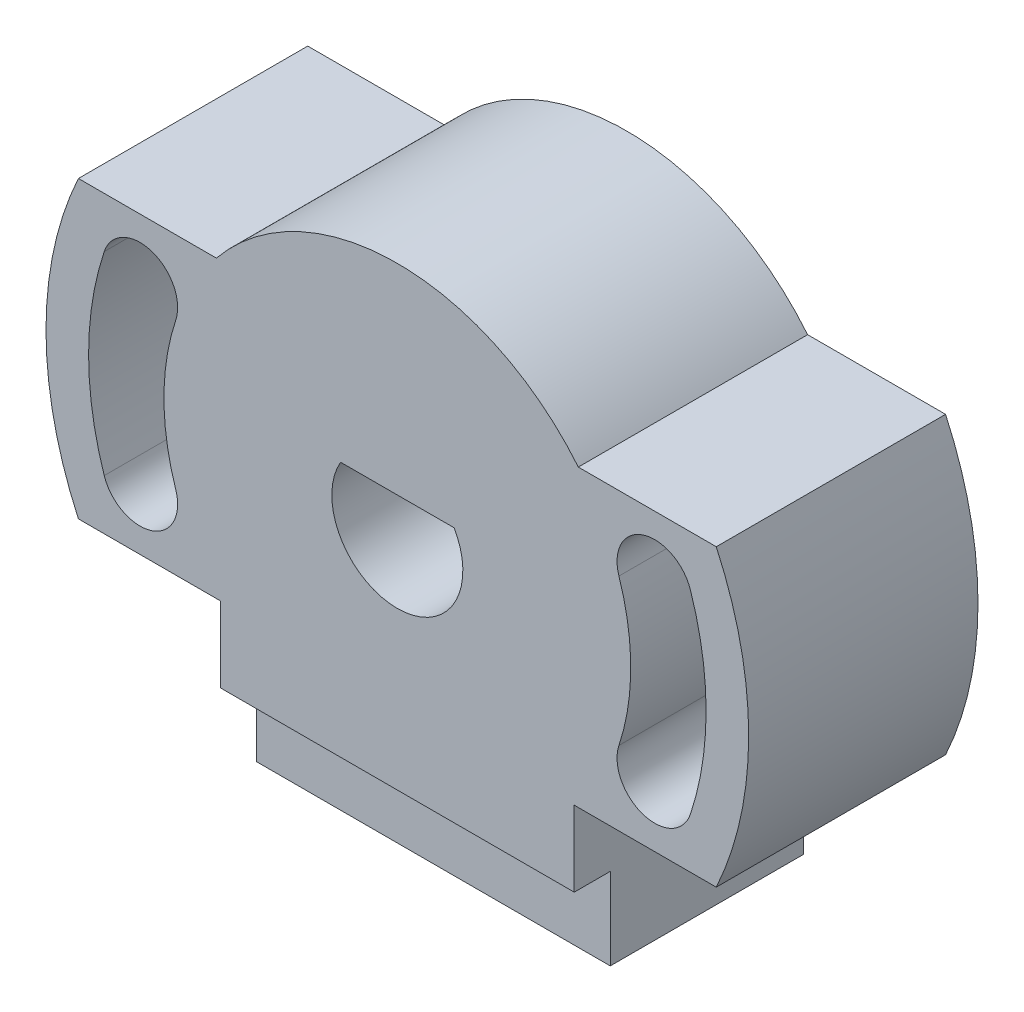
ISO-10303-21;
HEADER;
FILE_DESCRIPTION(('STEP AP214'),'2;1');
FILE_NAME('part.step','',(''),(''),'','','');
FILE_SCHEMA(('AUTOMOTIVE_DESIGN { 1 0 10303 214 1 1 1 1 }'));
ENDSEC;
DATA;
#1=APPLICATION_CONTEXT('core data for automotive mechanical design processes');
#2=APPLICATION_PROTOCOL_DEFINITION('international standard','automotive_design',2000,#1);
#3=PRODUCT_CONTEXT('',#1,'mechanical');
#4=PRODUCT('Part','Part','',(#3));
#5=PRODUCT_RELATED_PRODUCT_CATEGORY('part','',(#4));
#6=PRODUCT_DEFINITION_FORMATION('','',#4);
#7=PRODUCT_DEFINITION_CONTEXT('part definition',#1,'design');
#8=PRODUCT_DEFINITION('design','',#6,#7);
#9=PRODUCT_DEFINITION_SHAPE('','',#8);
#10=(LENGTH_UNIT() NAMED_UNIT(*) SI_UNIT(.MILLI.,.METRE.));
#11=(NAMED_UNIT(*) PLANE_ANGLE_UNIT() SI_UNIT($,.RADIAN.));
#12=(NAMED_UNIT(*) SI_UNIT($,.STERADIAN.) SOLID_ANGLE_UNIT());
#13=UNCERTAINTY_MEASURE_WITH_UNIT(LENGTH_MEASURE(1.E-05),#10,'distance_accuracy_value','');
#14=(GEOMETRIC_REPRESENTATION_CONTEXT(3) GLOBAL_UNCERTAINTY_ASSIGNED_CONTEXT((#13)) GLOBAL_UNIT_ASSIGNED_CONTEXT((#10,
#11,#12)) REPRESENTATION_CONTEXT('',''));
#15=CARTESIAN_POINT('',(0.,0.,0.));
#16=DIRECTION('',(0.,0.,1.));
#17=DIRECTION('',(1.,0.,0.));
#18=AXIS2_PLACEMENT_3D('',#15,#16,#17);
#19=CARTESIAN_POINT('',(3.72885617015816,-18.8585777942866,11.8));
#20=DIRECTION('',(0.,0.,1.));
#21=DIRECTION('',(1.,0.,0.));
#22=AXIS2_PLACEMENT_3D('',#19,#20,#21);
#23=PLANE('',#22);
#24=DIRECTION('',(0.,1.,0.));
#25=VECTOR('',#24,1.);
#26=CARTESIAN_POINT('',(-10.8,-18.0771189720301,11.8));
#27=LINE('',#26,#25);
#28=CARTESIAN_POINT('',(-10.8,-18.0771189720301,11.8));
#29=VERTEX_POINT('',#28);
#30=CARTESIAN_POINT('',(-10.8,-13.0771189720301,11.8));
#31=VERTEX_POINT('',#30);
#32=EDGE_CURVE('E205',#29,#31,#27,.T.);
#33=ORIENTED_EDGE('',*,*,#32,.F.);
#34=DIRECTION('',(1.,0.,0.));
#35=VECTOR('',#34,1.);
#36=CARTESIAN_POINT('',(10.8,-18.0771189720301,11.8));
#37=LINE('',#36,#35);
#38=CARTESIAN_POINT('',(10.8,-18.0771189720301,11.8));
#39=VERTEX_POINT('',#38);
#40=EDGE_CURVE('E189',#39,#29,#37,.F.);
#41=ORIENTED_EDGE('',*,*,#40,.F.);
#42=DIRECTION('',(0.,1.,0.));
#43=VECTOR('',#42,1.);
#44=CARTESIAN_POINT('',(10.8,-8.47711897203013,11.8));
#45=LINE('',#44,#43);
#46=CARTESIAN_POINT('',(10.8,-13.0771189720301,11.8));
#47=VERTEX_POINT('',#46);
#48=EDGE_CURVE('E196',#47,#39,#45,.F.);
#49=ORIENTED_EDGE('',*,*,#48,.F.);
#50=DIRECTION('',(1.,0.,0.));
#51=VECTOR('',#50,1.);
#52=CARTESIAN_POINT('',(20.6392325687335,-13.0771189720301,11.8));
#53=LINE('',#52,#51);
#54=EDGE_CURVE('E182',#47,#31,#53,.F.);
#55=ORIENTED_EDGE('',*,*,#54,.T.);
#56=EDGE_LOOP('',(#33,#41,#49,#55));
#57=FACE_BOUND('',#56,.T.);
#58=ADVANCED_FACE('F17',(#57),#23,.T.);
#59=CARTESIAN_POINT('',(20.6392325687335,-13.0771189720301,14.));
#60=DIRECTION('',(0.,1.,0.));
#61=DIRECTION('',(0.,0.,1.));
#62=AXIS2_PLACEMENT_3D('',#59,#60,#61);
#63=PLANE('',#62);
#64=DIRECTION('',(1.,0.,0.));
#65=VECTOR('',#64,1.);
#66=CARTESIAN_POINT('',(0.,-13.0771189720301,14.));
#67=LINE('',#66,#65);
#68=CARTESIAN_POINT('',(-10.8,-13.0771189720301,14.));
#69=VERTEX_POINT('',#68);
#70=CARTESIAN_POINT('',(10.8,-13.0771189720301,14.));
#71=VERTEX_POINT('',#70);
#72=EDGE_CURVE('E154',#69,#71,#67,.T.);
#73=ORIENTED_EDGE('',*,*,#72,.F.);
#74=DIRECTION('',(0.,0.,1.));
#75=VECTOR('',#74,1.);
#76=CARTESIAN_POINT('',(-10.8,-13.0771189720301,0.));
#77=LINE('',#76,#75);
#78=EDGE_CURVE('E208',#31,#69,#77,.T.);
#79=ORIENTED_EDGE('',*,*,#78,.F.);
#80=ORIENTED_EDGE('',*,*,#54,.F.);
#81=DIRECTION('',(0.,0.,-1.));
#82=VECTOR('',#81,1.);
#83=CARTESIAN_POINT('',(10.8,-13.0771189720301,0.));
#84=LINE('',#83,#82);
#85=EDGE_CURVE('E171',#71,#47,#84,.T.);
#86=ORIENTED_EDGE('',*,*,#85,.F.);
#87=EDGE_LOOP('',(#73,#79,#80,#86));
#88=FACE_BOUND('',#87,.T.);
#89=ADVANCED_FACE('F471',(#88),#63,.F.);
#90=CARTESIAN_POINT('',(0.,-2.13320245620259,14.));
#91=DIRECTION('',(0.,0.,1.));
#92=DIRECTION('',(1.,0.,0.));
#93=AXIS2_PLACEMENT_3D('',#90,#91,#92);
#94=PLANE('',#93);
#95=DIRECTION('',(1.,0.,0.));
#96=VECTOR('',#95,1.);
#97=CARTESIAN_POINT('',(-3.46410161513775,2.52288102796987,14.));
#98=LINE('',#97,#96);
#99=CARTESIAN_POINT('',(-3.46410161513775,2.52288102796987,14.));
#100=VERTEX_POINT('',#99);
#101=CARTESIAN_POINT('',(3.46410161513775,2.52288102796987,14.));
#102=VERTEX_POINT('',#101);
#103=EDGE_CURVE('E164',#100,#102,#98,.T.);
#104=ORIENTED_EDGE('',*,*,#103,.T.);
#105=CARTESIAN_POINT('',(0.,0.522881027969871,14.));
#106=DIRECTION('',(0.,0.,1.));
#107=DIRECTION('',(1.,0.,0.));
#108=AXIS2_PLACEMENT_3D('',#105,#106,#107);
#109=CIRCLE('',#108,4.);
#110=EDGE_CURVE('E263',#102,#100,#109,.F.);
#111=ORIENTED_EDGE('',*,*,#110,.T.);
#112=EDGE_LOOP('',(#104,#111));
#113=FACE_BOUND('',#112,.T.);
#114=CARTESIAN_POINT('',(15.7118585787933,5.72288102796987,14.));
#115=DIRECTION('',(0.,0.,1.));
#116=DIRECTION('',(1.,0.,0.));
#117=AXIS2_PLACEMENT_3D('',#114,#115,#116);
#118=CIRCLE('',#117,2.3);
#119=CARTESIAN_POINT('',(13.5283374469972,5.00022241769797,14.));
#120=VERTEX_POINT('',#119);
#121=CARTESIAN_POINT('',(17.8953797105893,6.44553963824178,14.));
#122=VERTEX_POINT('',#121);
#123=EDGE_CURVE('E274',#120,#122,#118,.F.);
#124=ORIENTED_EDGE('',*,*,#123,.T.);
#125=CARTESIAN_POINT('',(0.,0.522881027969871,14.));
#126=DIRECTION('',(0.,0.,1.));
#127=DIRECTION('',(1.,0.,0.));
#128=AXIS2_PLACEMENT_3D('',#125,#126,#127);
#129=CIRCLE('',#128,18.85);
#130=CARTESIAN_POINT('',(17.8953797105893,-5.39977758230203,14.));
#131=VERTEX_POINT('',#130);
#132=EDGE_CURVE('E270',#122,#131,#129,.F.);
#133=ORIENTED_EDGE('',*,*,#132,.T.);
#134=CARTESIAN_POINT('',(15.7118585787933,-4.67711897203013,14.));
#135=DIRECTION('',(0.,0.,1.));
#136=DIRECTION('',(1.,0.,0.));
#137=AXIS2_PLACEMENT_3D('',#134,#135,#136);
#138=CIRCLE('',#137,2.3);
#139=CARTESIAN_POINT('',(13.5283374469972,-3.95446036175823,14.));
#140=VERTEX_POINT('',#139);
#141=EDGE_CURVE('E266',#131,#140,#138,.F.);
#142=ORIENTED_EDGE('',*,*,#141,.T.);
#143=CARTESIAN_POINT('',(0.,0.522881027969871,14.));
#144=DIRECTION('',(0.,0.,1.));
#145=DIRECTION('',(1.,0.,0.));
#146=AXIS2_PLACEMENT_3D('',#143,#144,#145);
#147=CIRCLE('',#146,14.25);
#148=EDGE_CURVE('E277',#120,#140,#147,.F.);
#149=ORIENTED_EDGE('',*,*,#148,.F.);
#150=EDGE_LOOP('',(#124,#133,#142,#149));
#151=FACE_BOUND('',#150,.T.);
#152=CARTESIAN_POINT('',(-15.7118585787933,-4.67711897203013,14.));
#153=DIRECTION('',(0.,0.,1.));
#154=DIRECTION('',(1.,0.,0.));
#155=AXIS2_PLACEMENT_3D('',#152,#153,#154);
#156=CIRCLE('',#155,2.3);
#157=CARTESIAN_POINT('',(-13.5283374469972,-3.95446036175823,14.));
#158=VERTEX_POINT('',#157);
#159=CARTESIAN_POINT('',(-17.8953797105893,-5.39977758230203,14.));
#160=VERTEX_POINT('',#159);
#161=EDGE_CURVE('E287',#158,#160,#156,.F.);
#162=ORIENTED_EDGE('',*,*,#161,.T.);
#163=CARTESIAN_POINT('',(0.,0.522881027969871,14.));
#164=DIRECTION('',(0.,0.,1.));
#165=DIRECTION('',(1.,0.,0.));
#166=AXIS2_PLACEMENT_3D('',#163,#164,#165);
#167=CIRCLE('',#166,18.85);
#168=CARTESIAN_POINT('',(-17.8953797105893,6.44553963824177,14.));
#169=VERTEX_POINT('',#168);
#170=EDGE_CURVE('E283',#160,#169,#167,.F.);
#171=ORIENTED_EDGE('',*,*,#170,.T.);
#172=CARTESIAN_POINT('',(-15.7118585787933,5.72288102796987,14.));
#173=DIRECTION('',(0.,0.,1.));
#174=DIRECTION('',(1.,0.,0.));
#175=AXIS2_PLACEMENT_3D('',#172,#173,#174);
#176=CIRCLE('',#175,2.3);
#177=CARTESIAN_POINT('',(-13.5283374469972,5.00022241769797,14.));
#178=VERTEX_POINT('',#177);
#179=EDGE_CURVE('E279',#169,#178,#176,.F.);
#180=ORIENTED_EDGE('',*,*,#179,.T.);
#181=CARTESIAN_POINT('',(0.,0.522881027969871,14.));
#182=DIRECTION('',(0.,0.,1.));
#183=DIRECTION('',(1.,0.,0.));
#184=AXIS2_PLACEMENT_3D('',#181,#182,#183);
#185=CIRCLE('',#184,14.25);
#186=EDGE_CURVE('E290',#158,#178,#185,.F.);
#187=ORIENTED_EDGE('',*,*,#186,.F.);
#188=EDGE_LOOP('',(#162,#171,#180,#187));
#189=FACE_BOUND('',#188,.T.);
#190=DIRECTION('',(1.,0.,0.));
#191=VECTOR('',#190,1.);
#192=CARTESIAN_POINT('',(-10.8,-8.47711897203013,14.));
#193=LINE('',#192,#191);
#194=CARTESIAN_POINT('',(-10.8,-8.47711897203013,14.));
#195=VERTEX_POINT('',#194);
#196=CARTESIAN_POINT('',(-19.4705546916363,-8.47711897203013,14.));
#197=VERTEX_POINT('',#196);
#198=EDGE_CURVE('E212',#195,#197,#193,.F.);
#199=ORIENTED_EDGE('',*,*,#198,.F.);
#200=DIRECTION('',(0.,1.,0.));
#201=VECTOR('',#200,1.);
#202=CARTESIAN_POINT('',(-10.8,-18.0771189720301,14.));
#203=LINE('',#202,#201);
#204=EDGE_CURVE('E217',#69,#195,#203,.T.);
#205=ORIENTED_EDGE('',*,*,#204,.F.);
#206=ORIENTED_EDGE('',*,*,#72,.T.);
#207=DIRECTION('',(0.,1.,0.));
#208=VECTOR('',#207,1.);
#209=CARTESIAN_POINT('',(10.8,-8.47711897203013,14.));
#210=LINE('',#209,#208);
#211=CARTESIAN_POINT('',(10.8,-8.47711897203013,14.));
#212=VERTEX_POINT('',#211);
#213=EDGE_CURVE('E174',#212,#71,#210,.F.);
#214=ORIENTED_EDGE('',*,*,#213,.F.);
#215=DIRECTION('',(1.,0.,0.));
#216=VECTOR('',#215,1.);
#217=CARTESIAN_POINT('',(19.4705546916363,-8.47711897203013,14.));
#218=LINE('',#217,#216);
#219=CARTESIAN_POINT('',(19.4705546916363,-8.47711897203012,14.));
#220=VERTEX_POINT('',#219);
#221=EDGE_CURVE('E167',#220,#212,#218,.F.);
#222=ORIENTED_EDGE('',*,*,#221,.F.);
#223=CARTESIAN_POINT('',(0.,0.522881027969871,14.));
#224=DIRECTION('',(0.,0.,1.));
#225=DIRECTION('',(1.,0.,0.));
#226=AXIS2_PLACEMENT_3D('',#223,#224,#225);
#227=CIRCLE('',#226,21.45);
#228=CARTESIAN_POINT('',(19.4705546916363,9.52288102796987,14.));
#229=VERTEX_POINT('',#228);
#230=EDGE_CURVE('E150',#229,#220,#227,.F.);
#231=ORIENTED_EDGE('',*,*,#230,.F.);
#232=DIRECTION('',(1.,0.,0.));
#233=VECTOR('',#232,1.);
#234=CARTESIAN_POINT('',(11.0481898969922,9.52288102796987,14.));
#235=LINE('',#234,#233);
#236=CARTESIAN_POINT('',(11.0481898969922,9.52288102796987,14.));
#237=VERTEX_POINT('',#236);
#238=EDGE_CURVE('E145',#237,#229,#235,.T.);
#239=ORIENTED_EDGE('',*,*,#238,.F.);
#240=CARTESIAN_POINT('',(0.,0.522881027969871,14.));
#241=DIRECTION('',(0.,0.,1.));
#242=DIRECTION('',(1.,0.,0.));
#243=AXIS2_PLACEMENT_3D('',#240,#241,#242);
#244=CIRCLE('',#243,14.25);
#245=CARTESIAN_POINT('',(-11.0481898969922,9.52288102796987,14.));
#246=VERTEX_POINT('',#245);
#247=EDGE_CURVE('E20',#246,#237,#244,.F.);
#248=ORIENTED_EDGE('',*,*,#247,.F.);
#249=DIRECTION('',(1.,0.,0.));
#250=VECTOR('',#249,1.);
#251=CARTESIAN_POINT('',(-19.4705546916363,9.52288102796987,14.));
#252=LINE('',#251,#250);
#253=CARTESIAN_POINT('',(-19.4705546916363,9.52288102796987,14.));
#254=VERTEX_POINT('',#253);
#255=EDGE_CURVE('E132',#254,#246,#252,.T.);
#256=ORIENTED_EDGE('',*,*,#255,.F.);
#257=CARTESIAN_POINT('',(0.,0.522881027969871,14.));
#258=DIRECTION('',(0.,0.,1.));
#259=DIRECTION('',(1.,0.,0.));
#260=AXIS2_PLACEMENT_3D('',#257,#258,#259);
#261=CIRCLE('',#260,21.45);
#262=EDGE_CURVE('E294',#197,#254,#261,.F.);
#263=ORIENTED_EDGE('',*,*,#262,.F.);
#264=EDGE_LOOP('',(#199,#205,#206,#214,#222,#231,#239,#248,#256,#263));
#265=FACE_BOUND('',#264,.T.);
#266=ADVANCED_FACE('F148',(#113,#151,#189,#265),#94,.T.);
#267=CARTESIAN_POINT('',(11.0481898969922,9.52288102796987,0.));
#268=DIRECTION('',(0.,1.,0.));
#269=DIRECTION('',(0.,0.,1.));
#270=AXIS2_PLACEMENT_3D('',#267,#268,#269);
#271=PLANE('',#270);
#272=DIRECTION('',(1.,0.,0.));
#273=VECTOR('',#272,1.);
#274=CARTESIAN_POINT('',(0.,9.52288102796987,0.));
#275=LINE('',#274,#273);
#276=CARTESIAN_POINT('',(19.4705546916363,9.52288102796987,0.));
#277=VERTEX_POINT('',#276);
#278=CARTESIAN_POINT('',(11.0481898969922,9.52288102796987,0.));
#279=VERTEX_POINT('',#278);
#280=EDGE_CURVE('E158',#277,#279,#275,.F.);
#281=ORIENTED_EDGE('',*,*,#280,.T.);
#282=DIRECTION('',(0.,0.,1.));
#283=VECTOR('',#282,1.);
#284=CARTESIAN_POINT('',(11.0481898969922,9.52288102796987,0.));
#285=LINE('',#284,#283);
#286=EDGE_CURVE('E141',#237,#279,#285,.F.);
#287=ORIENTED_EDGE('',*,*,#286,.F.);
#288=ORIENTED_EDGE('',*,*,#238,.T.);
#289=DIRECTION('',(0.,0.,1.));
#290=VECTOR('',#289,1.);
#291=CARTESIAN_POINT('',(19.4705546916363,9.52288102796987,0.));
#292=LINE('',#291,#290);
#293=EDGE_CURVE('E292',#277,#229,#292,.T.);
#294=ORIENTED_EDGE('',*,*,#293,.F.);
#295=EDGE_LOOP('',(#281,#287,#288,#294));
#296=FACE_BOUND('',#295,.T.);
#297=ADVANCED_FACE('F157',(#296),#271,.T.);
#298=CARTESIAN_POINT('',(0.,0.522881027969871,0.));
#299=DIRECTION('',(0.,0.,1.));
#300=DIRECTION('',(1.,0.,0.));
#301=AXIS2_PLACEMENT_3D('',#298,#299,#300);
#302=CYLINDRICAL_SURFACE('',#301,14.25);
#303=CARTESIAN_POINT('',(0.,0.522881027969871,0.));
#304=DIRECTION('',(0.,0.,1.));
#305=DIRECTION('',(1.,0.,0.));
#306=AXIS2_PLACEMENT_3D('',#303,#304,#305);
#307=CIRCLE('',#306,14.25);
#308=CARTESIAN_POINT('',(-11.0481898969922,9.52288102796987,0.));
#309=VERTEX_POINT('',#308);
#310=EDGE_CURVE('E261',#279,#309,#307,.T.);
#311=ORIENTED_EDGE('',*,*,#310,.T.);
#312=DIRECTION('',(0.,0.,1.));
#313=VECTOR('',#312,1.);
#314=CARTESIAN_POINT('',(-11.0481898969922,9.52288102796987,0.));
#315=LINE('',#314,#313);
#316=EDGE_CURVE('E143',#246,#309,#315,.F.);
#317=ORIENTED_EDGE('',*,*,#316,.F.);
#318=ORIENTED_EDGE('',*,*,#247,.T.);
#319=ORIENTED_EDGE('',*,*,#286,.T.);
#320=EDGE_LOOP('',(#311,#317,#318,#319));
#321=FACE_BOUND('',#320,.T.);
#322=ADVANCED_FACE('F139',(#321),#302,.T.);
#323=CARTESIAN_POINT('',(-19.4705546916363,9.52288102796987,0.));
#324=DIRECTION('',(0.,1.,0.));
#325=DIRECTION('',(0.,0.,1.));
#326=AXIS2_PLACEMENT_3D('',#323,#324,#325);
#327=PLANE('',#326);
#328=DIRECTION('',(1.,0.,0.));
#329=VECTOR('',#328,1.);
#330=CARTESIAN_POINT('',(0.,9.52288102796987,0.));
#331=LINE('',#330,#329);
#332=CARTESIAN_POINT('',(-19.4705546916363,9.52288102796987,0.));
#333=VERTEX_POINT('',#332);
#334=EDGE_CURVE('E260',#309,#333,#331,.F.);
#335=ORIENTED_EDGE('',*,*,#334,.T.);
#336=DIRECTION('',(0.,0.,1.));
#337=VECTOR('',#336,1.);
#338=CARTESIAN_POINT('',(-19.4705546916363,9.52288102796987,0.));
#339=LINE('',#338,#337);
#340=EDGE_CURVE('E214',#254,#333,#339,.F.);
#341=ORIENTED_EDGE('',*,*,#340,.F.);
#342=ORIENTED_EDGE('',*,*,#255,.T.);
#343=ORIENTED_EDGE('',*,*,#316,.T.);
#344=EDGE_LOOP('',(#335,#341,#342,#343));
#345=FACE_BOUND('',#344,.T.);
#346=ADVANCED_FACE('F300',(#345),#327,.T.);
#347=CARTESIAN_POINT('',(0.,0.522881027969871,0.));
#348=DIRECTION('',(0.,0.,1.));
#349=DIRECTION('',(1.,0.,0.));
#350=AXIS2_PLACEMENT_3D('',#347,#348,#349);
#351=CYLINDRICAL_SURFACE('',#350,21.45);
#352=CARTESIAN_POINT('',(0.,0.522881027969871,0.));
#353=DIRECTION('',(0.,0.,1.));
#354=DIRECTION('',(1.,0.,0.));
#355=AXIS2_PLACEMENT_3D('',#352,#353,#354);
#356=CIRCLE('',#355,21.45);
#357=CARTESIAN_POINT('',(-19.4705546916363,-8.47711897203013,0.));
#358=VERTEX_POINT('',#357);
#359=EDGE_CURVE('E256',#333,#358,#356,.T.);
#360=ORIENTED_EDGE('',*,*,#359,.T.);
#361=DIRECTION('',(0.,0.,-1.));
#362=VECTOR('',#361,1.);
#363=CARTESIAN_POINT('',(-19.4705546916363,-8.47711897203013,0.));
#364=LINE('',#363,#362);
#365=EDGE_CURVE('E209',#197,#358,#364,.T.);
#366=ORIENTED_EDGE('',*,*,#365,.F.);
#367=ORIENTED_EDGE('',*,*,#262,.T.);
#368=ORIENTED_EDGE('',*,*,#340,.T.);
#369=EDGE_LOOP('',(#360,#366,#367,#368));
#370=FACE_BOUND('',#369,.T.);
#371=ADVANCED_FACE('F370',(#370),#351,.T.);
#372=CARTESIAN_POINT('',(-10.8,-8.47711897203013,0.));
#373=DIRECTION('',(0.,-1.,0.));
#374=DIRECTION('',(0.,0.,-1.));
#375=AXIS2_PLACEMENT_3D('',#372,#373,#374);
#376=PLANE('',#375);
#377=DIRECTION('',(1.,0.,0.));
#378=VECTOR('',#377,1.);
#379=CARTESIAN_POINT('',(0.,-8.47711897203013,0.));
#380=LINE('',#379,#378);
#381=CARTESIAN_POINT('',(-10.8,-8.47711897203013,0.));
#382=VERTEX_POINT('',#381);
#383=EDGE_CURVE('E259',#358,#382,#380,.T.);
#384=ORIENTED_EDGE('',*,*,#383,.T.);
#385=DIRECTION('',(0.,0.,1.));
#386=VECTOR('',#385,1.);
#387=CARTESIAN_POINT('',(-10.8,-8.47711897203013,0.));
#388=LINE('',#387,#386);
#389=EDGE_CURVE('E193',#195,#382,#388,.F.);
#390=ORIENTED_EDGE('',*,*,#389,.F.);
#391=ORIENTED_EDGE('',*,*,#198,.T.);
#392=ORIENTED_EDGE('',*,*,#365,.T.);
#393=EDGE_LOOP('',(#384,#390,#391,#392));
#394=FACE_BOUND('',#393,.T.);
#395=ADVANCED_FACE('F366',(#394),#376,.T.);
#396=CARTESIAN_POINT('',(-10.8,-18.0771189720301,0.));
#397=DIRECTION('',(-1.,0.,0.));
#398=DIRECTION('',(0.,0.,1.));
#399=AXIS2_PLACEMENT_3D('',#396,#397,#398);
#400=PLANE('',#399);
#401=DIRECTION('',(0.,1.,0.));
#402=VECTOR('',#401,1.);
#403=CARTESIAN_POINT('',(-10.8,-2.13320245620259,0.));
#404=LINE('',#403,#402);
#405=CARTESIAN_POINT('',(-10.8,-18.0771189720301,0.));
#406=VERTEX_POINT('',#405);
#407=EDGE_CURVE('E349',#382,#406,#404,.F.);
#408=ORIENTED_EDGE('',*,*,#407,.T.);
#409=DIRECTION('',(0.,0.,-1.));
#410=VECTOR('',#409,1.);
#411=CARTESIAN_POINT('',(-10.8,-18.0771189720301,0.));
#412=LINE('',#411,#410);
#413=EDGE_CURVE('E192',#29,#406,#412,.T.);
#414=ORIENTED_EDGE('',*,*,#413,.F.);
#415=ORIENTED_EDGE('',*,*,#32,.T.);
#416=ORIENTED_EDGE('',*,*,#78,.T.);
#417=ORIENTED_EDGE('',*,*,#204,.T.);
#418=ORIENTED_EDGE('',*,*,#389,.T.);
#419=EDGE_LOOP('',(#408,#414,#415,#416,#417,#418));
#420=FACE_BOUND('',#419,.T.);
#421=ADVANCED_FACE('F378',(#420),#400,.T.);
#422=CARTESIAN_POINT('',(10.8,-18.0771189720301,0.));
#423=DIRECTION('',(0.,-1.,0.));
#424=DIRECTION('',(0.,0.,-1.));
#425=AXIS2_PLACEMENT_3D('',#422,#423,#424);
#426=PLANE('',#425);
#427=DIRECTION('',(1.,0.,0.));
#428=VECTOR('',#427,1.);
#429=CARTESIAN_POINT('',(0.,-18.0771189720301,0.));
#430=LINE('',#429,#428);
#431=CARTESIAN_POINT('',(10.8,-18.0771189720301,0.));
#432=VERTEX_POINT('',#431);
#433=EDGE_CURVE('E340',#406,#432,#430,.T.);
#434=ORIENTED_EDGE('',*,*,#433,.T.);
#435=DIRECTION('',(0.,0.,-1.));
#436=VECTOR('',#435,1.);
#437=CARTESIAN_POINT('',(10.8,-18.0771189720301,0.));
#438=LINE('',#437,#436);
#439=EDGE_CURVE('E177',#39,#432,#438,.T.);
#440=ORIENTED_EDGE('',*,*,#439,.F.);
#441=ORIENTED_EDGE('',*,*,#40,.T.);
#442=ORIENTED_EDGE('',*,*,#413,.T.);
#443=EDGE_LOOP('',(#434,#440,#441,#442));
#444=FACE_BOUND('',#443,.T.);
#445=ADVANCED_FACE('F438',(#444),#426,.T.);
#446=CARTESIAN_POINT('',(10.8,-8.47711897203013,0.));
#447=DIRECTION('',(1.,0.,0.));
#448=DIRECTION('',(0.,0.,-1.));
#449=AXIS2_PLACEMENT_3D('',#446,#447,#448);
#450=PLANE('',#449);
#451=ORIENTED_EDGE('',*,*,#213,.T.);
#452=ORIENTED_EDGE('',*,*,#85,.T.);
#453=ORIENTED_EDGE('',*,*,#48,.T.);
#454=ORIENTED_EDGE('',*,*,#439,.T.);
#455=DIRECTION('',(0.,1.,0.));
#456=VECTOR('',#455,1.);
#457=CARTESIAN_POINT('',(10.8,-2.13320245620259,0.));
#458=LINE('',#457,#456);
#459=CARTESIAN_POINT('',(10.8,-8.47711897203013,0.));
#460=VERTEX_POINT('',#459);
#461=EDGE_CURVE('E337',#432,#460,#458,.T.);
#462=ORIENTED_EDGE('',*,*,#461,.T.);
#463=DIRECTION('',(0.,0.,-1.));
#464=VECTOR('',#463,1.);
#465=CARTESIAN_POINT('',(10.8,-8.47711897203013,0.));
#466=LINE('',#465,#464);
#467=EDGE_CURVE('E170',#212,#460,#466,.T.);
#468=ORIENTED_EDGE('',*,*,#467,.F.);
#469=EDGE_LOOP('',(#451,#452,#453,#454,#462,#468));
#470=FACE_BOUND('',#469,.T.);
#471=ADVANCED_FACE('F434',(#470),#450,.T.);
#472=CARTESIAN_POINT('',(19.4705546916363,-8.47711897203013,0.));
#473=DIRECTION('',(0.,-1.,0.));
#474=DIRECTION('',(0.,0.,-1.));
#475=AXIS2_PLACEMENT_3D('',#472,#473,#474);
#476=PLANE('',#475);
#477=DIRECTION('',(1.,0.,0.));
#478=VECTOR('',#477,1.);
#479=CARTESIAN_POINT('',(0.,-8.47711897203013,0.));
#480=LINE('',#479,#478);
#481=CARTESIAN_POINT('',(19.4705546916363,-8.47711897203012,0.));
#482=VERTEX_POINT('',#481);
#483=EDGE_CURVE('E255',#460,#482,#480,.T.);
#484=ORIENTED_EDGE('',*,*,#483,.T.);
#485=DIRECTION('',(0.,0.,1.));
#486=VECTOR('',#485,1.);
#487=CARTESIAN_POINT('',(19.4705546916363,-8.47711897203012,0.));
#488=LINE('',#487,#486);
#489=EDGE_CURVE('E293',#220,#482,#488,.F.);
#490=ORIENTED_EDGE('',*,*,#489,.F.);
#491=ORIENTED_EDGE('',*,*,#221,.T.);
#492=ORIENTED_EDGE('',*,*,#467,.T.);
#493=EDGE_LOOP('',(#484,#490,#491,#492));
#494=FACE_BOUND('',#493,.T.);
#495=ADVANCED_FACE('F430',(#494),#476,.T.);
#496=CARTESIAN_POINT('',(0.,0.522881027969871,0.));
#497=DIRECTION('',(0.,0.,1.));
#498=DIRECTION('',(1.,0.,0.));
#499=AXIS2_PLACEMENT_3D('',#496,#497,#498);
#500=CYLINDRICAL_SURFACE('',#499,21.45);
#501=CARTESIAN_POINT('',(0.,0.522881027969871,0.));
#502=DIRECTION('',(0.,0.,1.));
#503=DIRECTION('',(1.,0.,0.));
#504=AXIS2_PLACEMENT_3D('',#501,#502,#503);
#505=CIRCLE('',#504,21.45);
#506=EDGE_CURVE('E252',#482,#277,#505,.T.);
#507=ORIENTED_EDGE('',*,*,#506,.T.);
#508=ORIENTED_EDGE('',*,*,#293,.T.);
#509=ORIENTED_EDGE('',*,*,#230,.T.);
#510=ORIENTED_EDGE('',*,*,#489,.T.);
#511=EDGE_LOOP('',(#507,#508,#509,#510));
#512=FACE_BOUND('',#511,.T.);
#513=ADVANCED_FACE('F426',(#512),#500,.T.);
#514=CARTESIAN_POINT('',(0.,0.522881027969871,0.));
#515=DIRECTION('',(0.,0.,1.));
#516=DIRECTION('',(1.,0.,0.));
#517=AXIS2_PLACEMENT_3D('',#514,#515,#516);
#518=CYLINDRICAL_SURFACE('',#517,14.25);
#519=CARTESIAN_POINT('',(0.,0.522881027969871,0.));
#520=DIRECTION('',(0.,0.,1.));
#521=DIRECTION('',(1.,0.,0.));
#522=AXIS2_PLACEMENT_3D('',#519,#520,#521);
#523=CIRCLE('',#522,14.25);
#524=CARTESIAN_POINT('',(-13.5283374469972,5.00022241769797,0.));
#525=VERTEX_POINT('',#524);
#526=CARTESIAN_POINT('',(-13.5283374469972,-3.95446036175823,0.));
#527=VERTEX_POINT('',#526);
#528=EDGE_CURVE('E249',#525,#527,#523,.T.);
#529=ORIENTED_EDGE('',*,*,#528,.T.);
#530=DIRECTION('',(0.,0.,1.));
#531=VECTOR('',#530,1.);
#532=CARTESIAN_POINT('',(-13.5283374469972,-3.95446036175823,0.));
#533=LINE('',#532,#531);
#534=EDGE_CURVE('E289',#527,#158,#533,.T.);
#535=ORIENTED_EDGE('',*,*,#534,.T.);
#536=ORIENTED_EDGE('',*,*,#186,.T.);
#537=DIRECTION('',(0.,0.,1.));
#538=VECTOR('',#537,1.);
#539=CARTESIAN_POINT('',(-13.5283374469972,5.00022241769797,0.));
#540=LINE('',#539,#538);
#541=EDGE_CURVE('E285',#178,#525,#540,.F.);
#542=ORIENTED_EDGE('',*,*,#541,.T.);
#543=EDGE_LOOP('',(#529,#535,#536,#542));
#544=FACE_BOUND('',#543,.T.);
#545=ADVANCED_FACE('F422',(#544),#518,.T.);
#546=CARTESIAN_POINT('',(-15.7118585787933,-4.67711897203013,0.));
#547=DIRECTION('',(0.,0.,1.));
#548=DIRECTION('',(1.,0.,0.));
#549=AXIS2_PLACEMENT_3D('',#546,#547,#548);
#550=CYLINDRICAL_SURFACE('',#549,2.3);
#551=ORIENTED_EDGE('',*,*,#534,.F.);
#552=CARTESIAN_POINT('',(-15.7118585787933,-4.67711897203013,0.));
#553=DIRECTION('',(0.,0.,1.));
#554=DIRECTION('',(1.,0.,0.));
#555=AXIS2_PLACEMENT_3D('',#552,#553,#554);
#556=CIRCLE('',#555,2.3);
#557=CARTESIAN_POINT('',(-17.8953797105893,-5.39977758230203,0.));
#558=VERTEX_POINT('',#557);
#559=EDGE_CURVE('E246',#527,#558,#556,.F.);
#560=ORIENTED_EDGE('',*,*,#559,.T.);
#561=DIRECTION('',(0.,0.,1.));
#562=VECTOR('',#561,1.);
#563=CARTESIAN_POINT('',(-17.8953797105893,-5.39977758230202,0.));
#564=LINE('',#563,#562);
#565=EDGE_CURVE('E286',#558,#160,#564,.T.);
#566=ORIENTED_EDGE('',*,*,#565,.T.);
#567=ORIENTED_EDGE('',*,*,#161,.F.);
#568=EDGE_LOOP('',(#551,#560,#566,#567));
#569=FACE_BOUND('',#568,.T.);
#570=ADVANCED_FACE('F418',(#569),#550,.F.);
#571=CARTESIAN_POINT('',(0.,0.522881027969871,0.));
#572=DIRECTION('',(0.,0.,1.));
#573=DIRECTION('',(1.,0.,0.));
#574=AXIS2_PLACEMENT_3D('',#571,#572,#573);
#575=CYLINDRICAL_SURFACE('',#574,18.85);
#576=ORIENTED_EDGE('',*,*,#565,.F.);
#577=CARTESIAN_POINT('',(0.,0.522881027969871,0.));
#578=DIRECTION('',(0.,0.,1.));
#579=DIRECTION('',(1.,0.,0.));
#580=AXIS2_PLACEMENT_3D('',#577,#578,#579);
#581=CIRCLE('',#580,18.85);
#582=CARTESIAN_POINT('',(-17.8953797105893,6.44553963824178,0.));
#583=VERTEX_POINT('',#582);
#584=EDGE_CURVE('E243',#558,#583,#581,.F.);
#585=ORIENTED_EDGE('',*,*,#584,.T.);
#586=DIRECTION('',(0.,0.,1.));
#587=VECTOR('',#586,1.);
#588=CARTESIAN_POINT('',(-17.8953797105893,6.44553963824177,0.));
#589=LINE('',#588,#587);
#590=EDGE_CURVE('E282',#583,#169,#589,.T.);
#591=ORIENTED_EDGE('',*,*,#590,.T.);
#592=ORIENTED_EDGE('',*,*,#170,.F.);
#593=EDGE_LOOP('',(#576,#585,#591,#592));
#594=FACE_BOUND('',#593,.T.);
#595=ADVANCED_FACE('F414',(#594),#575,.F.);
#596=CARTESIAN_POINT('',(-15.7118585787933,5.72288102796987,0.));
#597=DIRECTION('',(0.,0.,1.));
#598=DIRECTION('',(1.,0.,0.));
#599=AXIS2_PLACEMENT_3D('',#596,#597,#598);
#600=CYLINDRICAL_SURFACE('',#599,2.3);
#601=ORIENTED_EDGE('',*,*,#590,.F.);
#602=CARTESIAN_POINT('',(-15.7118585787933,5.72288102796987,0.));
#603=DIRECTION('',(0.,0.,1.));
#604=DIRECTION('',(1.,0.,0.));
#605=AXIS2_PLACEMENT_3D('',#602,#603,#604);
#606=CIRCLE('',#605,2.3);
#607=EDGE_CURVE('E240',#583,#525,#606,.F.);
#608=ORIENTED_EDGE('',*,*,#607,.T.);
#609=ORIENTED_EDGE('',*,*,#541,.F.);
#610=ORIENTED_EDGE('',*,*,#179,.F.);
#611=EDGE_LOOP('',(#601,#608,#609,#610));
#612=FACE_BOUND('',#611,.T.);
#613=ADVANCED_FACE('F410',(#612),#600,.F.);
#614=CARTESIAN_POINT('',(0.,0.522881027969871,0.));
#615=DIRECTION('',(0.,0.,1.));
#616=DIRECTION('',(1.,0.,0.));
#617=AXIS2_PLACEMENT_3D('',#614,#615,#616);
#618=CYLINDRICAL_SURFACE('',#617,14.25);
#619=CARTESIAN_POINT('',(0.,0.522881027969871,0.));
#620=DIRECTION('',(0.,0.,1.));
#621=DIRECTION('',(1.,0.,0.));
#622=AXIS2_PLACEMENT_3D('',#619,#620,#621);
#623=CIRCLE('',#622,14.25);
#624=CARTESIAN_POINT('',(13.5283374469972,-3.95446036175823,0.));
#625=VERTEX_POINT('',#624);
#626=CARTESIAN_POINT('',(13.5283374469972,5.00022241769797,0.));
#627=VERTEX_POINT('',#626);
#628=EDGE_CURVE('E237',#625,#627,#623,.T.);
#629=ORIENTED_EDGE('',*,*,#628,.T.);
#630=DIRECTION('',(0.,0.,1.));
#631=VECTOR('',#630,1.);
#632=CARTESIAN_POINT('',(13.5283374469972,5.00022241769797,0.));
#633=LINE('',#632,#631);
#634=EDGE_CURVE('E276',#627,#120,#633,.T.);
#635=ORIENTED_EDGE('',*,*,#634,.T.);
#636=ORIENTED_EDGE('',*,*,#148,.T.);
#637=DIRECTION('',(0.,0.,1.));
#638=VECTOR('',#637,1.);
#639=CARTESIAN_POINT('',(13.5283374469972,-3.95446036175822,0.));
#640=LINE('',#639,#638);
#641=EDGE_CURVE('E272',#140,#625,#640,.F.);
#642=ORIENTED_EDGE('',*,*,#641,.T.);
#643=EDGE_LOOP('',(#629,#635,#636,#642));
#644=FACE_BOUND('',#643,.T.);
#645=ADVANCED_FACE('F406',(#644),#618,.T.);
#646=CARTESIAN_POINT('',(15.7118585787933,5.72288102796987,0.));
#647=DIRECTION('',(0.,0.,1.));
#648=DIRECTION('',(1.,0.,0.));
#649=AXIS2_PLACEMENT_3D('',#646,#647,#648);
#650=CYLINDRICAL_SURFACE('',#649,2.3);
#651=ORIENTED_EDGE('',*,*,#634,.F.);
#652=CARTESIAN_POINT('',(15.7118585787933,5.72288102796987,0.));
#653=DIRECTION('',(0.,0.,1.));
#654=DIRECTION('',(1.,0.,0.));
#655=AXIS2_PLACEMENT_3D('',#652,#653,#654);
#656=CIRCLE('',#655,2.3);
#657=CARTESIAN_POINT('',(17.8953797105893,6.44553963824178,0.));
#658=VERTEX_POINT('',#657);
#659=EDGE_CURVE('E234',#627,#658,#656,.F.);
#660=ORIENTED_EDGE('',*,*,#659,.T.);
#661=DIRECTION('',(0.,0.,1.));
#662=VECTOR('',#661,1.);
#663=CARTESIAN_POINT('',(17.8953797105893,6.44553963824178,0.));
#664=LINE('',#663,#662);
#665=EDGE_CURVE('E273',#658,#122,#664,.T.);
#666=ORIENTED_EDGE('',*,*,#665,.T.);
#667=ORIENTED_EDGE('',*,*,#123,.F.);
#668=EDGE_LOOP('',(#651,#660,#666,#667));
#669=FACE_BOUND('',#668,.T.);
#670=ADVANCED_FACE('F402',(#669),#650,.F.);
#671=CARTESIAN_POINT('',(0.,0.522881027969871,0.));
#672=DIRECTION('',(0.,0.,1.));
#673=DIRECTION('',(1.,0.,0.));
#674=AXIS2_PLACEMENT_3D('',#671,#672,#673);
#675=CYLINDRICAL_SURFACE('',#674,18.85);
#676=ORIENTED_EDGE('',*,*,#665,.F.);
#677=CARTESIAN_POINT('',(0.,0.522881027969871,0.));
#678=DIRECTION('',(0.,0.,1.));
#679=DIRECTION('',(1.,0.,0.));
#680=AXIS2_PLACEMENT_3D('',#677,#678,#679);
#681=CIRCLE('',#680,18.85);
#682=CARTESIAN_POINT('',(17.8953797105893,-5.39977758230203,0.));
#683=VERTEX_POINT('',#682);
#684=EDGE_CURVE('E231',#658,#683,#681,.F.);
#685=ORIENTED_EDGE('',*,*,#684,.T.);
#686=DIRECTION('',(0.,0.,1.));
#687=VECTOR('',#686,1.);
#688=CARTESIAN_POINT('',(17.8953797105893,-5.39977758230203,0.));
#689=LINE('',#688,#687);
#690=EDGE_CURVE('E269',#683,#131,#689,.T.);
#691=ORIENTED_EDGE('',*,*,#690,.T.);
#692=ORIENTED_EDGE('',*,*,#132,.F.);
#693=EDGE_LOOP('',(#676,#685,#691,#692));
#694=FACE_BOUND('',#693,.T.);
#695=ADVANCED_FACE('F398',(#694),#675,.F.);
#696=CARTESIAN_POINT('',(15.7118585787933,-4.67711897203013,0.));
#697=DIRECTION('',(0.,0.,1.));
#698=DIRECTION('',(1.,0.,0.));
#699=AXIS2_PLACEMENT_3D('',#696,#697,#698);
#700=CYLINDRICAL_SURFACE('',#699,2.3);
#701=ORIENTED_EDGE('',*,*,#690,.F.);
#702=CARTESIAN_POINT('',(15.7118585787933,-4.67711897203013,0.));
#703=DIRECTION('',(0.,0.,1.));
#704=DIRECTION('',(1.,0.,0.));
#705=AXIS2_PLACEMENT_3D('',#702,#703,#704);
#706=CIRCLE('',#705,2.3);
#707=EDGE_CURVE('E228',#683,#625,#706,.F.);
#708=ORIENTED_EDGE('',*,*,#707,.T.);
#709=ORIENTED_EDGE('',*,*,#641,.F.);
#710=ORIENTED_EDGE('',*,*,#141,.F.);
#711=EDGE_LOOP('',(#701,#708,#709,#710));
#712=FACE_BOUND('',#711,.T.);
#713=ADVANCED_FACE('F394',(#712),#700,.F.);
#714=CARTESIAN_POINT('',(0.,0.522881027969871,0.));
#715=DIRECTION('',(0.,0.,1.));
#716=DIRECTION('',(1.,0.,0.));
#717=AXIS2_PLACEMENT_3D('',#714,#715,#716);
#718=CYLINDRICAL_SURFACE('',#717,4.);
#719=DIRECTION('',(0.,0.,1.));
#720=VECTOR('',#719,1.);
#721=CARTESIAN_POINT('',(3.46410161513775,2.52288102796987,0.));
#722=LINE('',#721,#720);
#723=CARTESIAN_POINT('',(3.46410161513775,2.52288102796987,0.));
#724=VERTEX_POINT('',#723);
#725=EDGE_CURVE('E265',#102,#724,#722,.F.);
#726=ORIENTED_EDGE('',*,*,#725,.T.);
#727=CARTESIAN_POINT('',(0.,0.522881027969871,0.));
#728=DIRECTION('',(0.,0.,1.));
#729=DIRECTION('',(1.,0.,0.));
#730=AXIS2_PLACEMENT_3D('',#727,#728,#729);
#731=CIRCLE('',#730,4.);
#732=CARTESIAN_POINT('',(-3.46410161513775,2.52288102796987,0.));
#733=VERTEX_POINT('',#732);
#734=EDGE_CURVE('E26',#724,#733,#731,.F.);
#735=ORIENTED_EDGE('',*,*,#734,.T.);
#736=DIRECTION('',(0.,0.,1.));
#737=VECTOR('',#736,1.);
#738=CARTESIAN_POINT('',(-3.46410161513775,2.52288102796987,0.));
#739=LINE('',#738,#737);
#740=EDGE_CURVE('E34',#733,#100,#739,.T.);
#741=ORIENTED_EDGE('',*,*,#740,.T.);
#742=ORIENTED_EDGE('',*,*,#110,.F.);
#743=EDGE_LOOP('',(#726,#735,#741,#742));
#744=FACE_BOUND('',#743,.T.);
#745=ADVANCED_FACE('F388',(#744),#718,.F.);
#746=CARTESIAN_POINT('',(-3.46410161513775,2.52288102796987,0.));
#747=DIRECTION('',(0.,1.,0.));
#748=DIRECTION('',(0.,0.,1.));
#749=AXIS2_PLACEMENT_3D('',#746,#747,#748);
#750=PLANE('',#749);
#751=ORIENTED_EDGE('',*,*,#740,.F.);
#752=DIRECTION('',(1.,0.,0.));
#753=VECTOR('',#752,1.);
#754=CARTESIAN_POINT('',(0.,2.52288102796987,0.));
#755=LINE('',#754,#753);
#756=EDGE_CURVE('E11',#733,#724,#755,.T.);
#757=ORIENTED_EDGE('',*,*,#756,.T.);
#758=ORIENTED_EDGE('',*,*,#725,.F.);
#759=ORIENTED_EDGE('',*,*,#103,.F.);
#760=EDGE_LOOP('',(#751,#757,#758,#759));
#761=FACE_BOUND('',#760,.T.);
#762=ADVANCED_FACE('F382',(#761),#750,.F.);
#763=CARTESIAN_POINT('',(0.,-2.13320245620259,0.));
#764=DIRECTION('',(0.,0.,1.));
#765=DIRECTION('',(1.,0.,0.));
#766=AXIS2_PLACEMENT_3D('',#763,#764,#765);
#767=PLANE('',#766);
#768=ORIENTED_EDGE('',*,*,#734,.F.);
#769=ORIENTED_EDGE('',*,*,#756,.F.);
#770=EDGE_LOOP('',(#768,#769));
#771=FACE_BOUND('',#770,.T.);
#772=ORIENTED_EDGE('',*,*,#684,.F.);
#773=ORIENTED_EDGE('',*,*,#659,.F.);
#774=ORIENTED_EDGE('',*,*,#628,.F.);
#775=ORIENTED_EDGE('',*,*,#707,.F.);
#776=EDGE_LOOP('',(#772,#773,#774,#775));
#777=FACE_BOUND('',#776,.T.);
#778=ORIENTED_EDGE('',*,*,#584,.F.);
#779=ORIENTED_EDGE('',*,*,#559,.F.);
#780=ORIENTED_EDGE('',*,*,#528,.F.);
#781=ORIENTED_EDGE('',*,*,#607,.F.);
#782=EDGE_LOOP('',(#778,#779,#780,#781));
#783=FACE_BOUND('',#782,.T.);
#784=ORIENTED_EDGE('',*,*,#483,.F.);
#785=ORIENTED_EDGE('',*,*,#461,.F.);
#786=ORIENTED_EDGE('',*,*,#433,.F.);
#787=ORIENTED_EDGE('',*,*,#407,.F.);
#788=ORIENTED_EDGE('',*,*,#383,.F.);
#789=ORIENTED_EDGE('',*,*,#359,.F.);
#790=ORIENTED_EDGE('',*,*,#334,.F.);
#791=ORIENTED_EDGE('',*,*,#310,.F.);
#792=ORIENTED_EDGE('',*,*,#280,.F.);
#793=ORIENTED_EDGE('',*,*,#506,.F.);
#794=EDGE_LOOP('',(#784,#785,#786,#787,#788,#789,#790,#791,#792,#793));
#795=FACE_BOUND('',#794,.T.);
#796=ADVANCED_FACE('F304',(#771,#777,#783,#795),#767,.F.);
#797=CLOSED_SHELL('',(#58,#89,#266,#297,#322,#346,#371,#395,#421,#445,#471,#495,#513,#545,#570,
#595,#613,#645,#670,#695,#713,#745,#762,#796));
#798=MANIFOLD_SOLID_BREP('B1',#797);
#799=ADVANCED_BREP_SHAPE_REPRESENTATION('',(#18,#798),#14);
#800=SHAPE_DEFINITION_REPRESENTATION(#9,#799);
ENDSEC;
END-ISO-10303-21;
